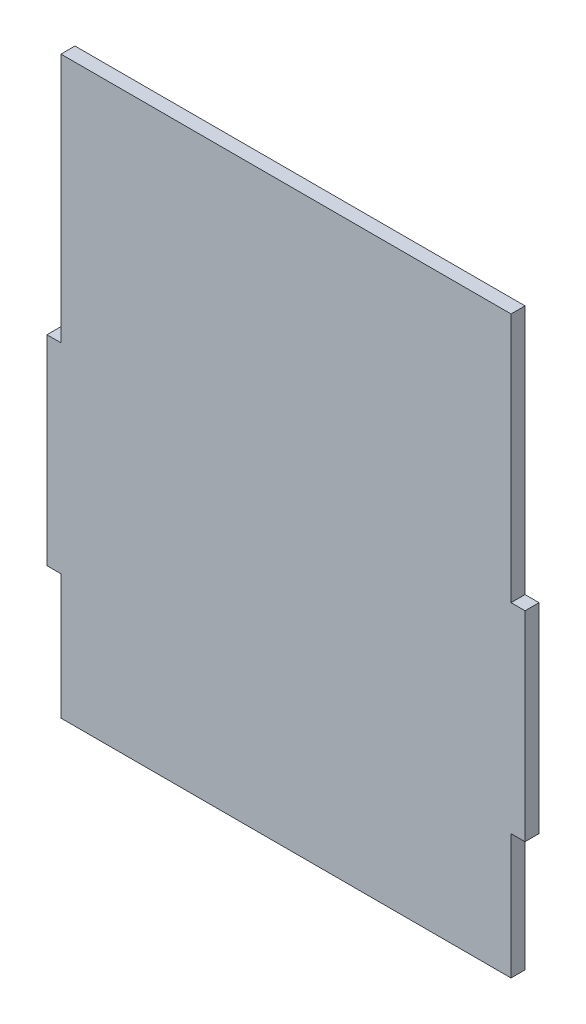
ISO-10303-21;
HEADER;
FILE_DESCRIPTION(('STEP AP214'),'2;1');
FILE_NAME('part.step','',(''),(''),'','','');
FILE_SCHEMA(('AUTOMOTIVE_DESIGN { 1 0 10303 214 1 1 1 1 }'));
ENDSEC;
DATA;
#1=APPLICATION_CONTEXT('core data for automotive mechanical design processes');
#2=APPLICATION_PROTOCOL_DEFINITION('international standard','automotive_design',2000,#1);
#3=PRODUCT_CONTEXT('',#1,'mechanical');
#4=PRODUCT('Part','Part','',(#3));
#5=PRODUCT_RELATED_PRODUCT_CATEGORY('part','',(#4));
#6=PRODUCT_DEFINITION_FORMATION('','',#4);
#7=PRODUCT_DEFINITION_CONTEXT('part definition',#1,'design');
#8=PRODUCT_DEFINITION('design','',#6,#7);
#9=PRODUCT_DEFINITION_SHAPE('','',#8);
#10=(LENGTH_UNIT() NAMED_UNIT(*) SI_UNIT(.MILLI.,.METRE.));
#11=(NAMED_UNIT(*) PLANE_ANGLE_UNIT() SI_UNIT($,.RADIAN.));
#12=(NAMED_UNIT(*) SI_UNIT($,.STERADIAN.) SOLID_ANGLE_UNIT());
#13=UNCERTAINTY_MEASURE_WITH_UNIT(LENGTH_MEASURE(1.E-05),#10,'distance_accuracy_value','');
#14=(GEOMETRIC_REPRESENTATION_CONTEXT(3) GLOBAL_UNCERTAINTY_ASSIGNED_CONTEXT((#13)) GLOBAL_UNIT_ASSIGNED_CONTEXT((#10,
#11,#12)) REPRESENTATION_CONTEXT('',''));
#15=CARTESIAN_POINT('',(0.,0.,0.));
#16=DIRECTION('',(0.,0.,1.));
#17=DIRECTION('',(1.,0.,0.));
#18=AXIS2_PLACEMENT_3D('',#15,#16,#17);
#19=CARTESIAN_POINT('',(45.,7.50000000000001,1.4));
#20=DIRECTION('',(-1.,0.,0.));
#21=DIRECTION('',(0.,-1.,0.));
#22=AXIS2_PLACEMENT_3D('',#19,#20,#21);
#23=PLANE('',#22);
#24=DIRECTION('',(0.,1.,0.));
#25=VECTOR('',#24,1.);
#26=CARTESIAN_POINT('',(45.,7.50000000000001,-1.4));
#27=LINE('',#26,#25);
#28=CARTESIAN_POINT('',(45.,7.50000000000001,-1.4));
#29=VERTEX_POINT('',#28);
#30=CARTESIAN_POINT('',(45.,57.5,-1.4));
#31=VERTEX_POINT('',#30);
#32=EDGE_CURVE('E164',#29,#31,#27,.T.);
#33=ORIENTED_EDGE('',*,*,#32,.T.);
#34=DIRECTION('',(0.,0.,-1.));
#35=VECTOR('',#34,1.);
#36=CARTESIAN_POINT('',(45.,57.5,1.4));
#37=LINE('',#36,#35);
#38=CARTESIAN_POINT('',(45.,57.5,1.4));
#39=VERTEX_POINT('',#38);
#40=EDGE_CURVE('E11',#39,#31,#37,.T.);
#41=ORIENTED_EDGE('',*,*,#40,.F.);
#42=DIRECTION('',(0.,1.,0.));
#43=VECTOR('',#42,1.);
#44=CARTESIAN_POINT('',(45.,7.50000000000001,1.4));
#45=LINE('',#44,#43);
#46=CARTESIAN_POINT('',(45.,7.50000000000001,1.4));
#47=VERTEX_POINT('',#46);
#48=EDGE_CURVE('E198',#47,#39,#45,.T.);
#49=ORIENTED_EDGE('',*,*,#48,.F.);
#50=DIRECTION('',(0.,0.,-1.));
#51=VECTOR('',#50,1.);
#52=CARTESIAN_POINT('',(45.,7.50000000000001,1.4));
#53=LINE('',#52,#51);
#54=EDGE_CURVE('E160',#47,#29,#53,.T.);
#55=ORIENTED_EDGE('',*,*,#54,.T.);
#56=EDGE_LOOP('',(#33,#41,#49,#55));
#57=FACE_BOUND('',#56,.T.);
#58=ADVANCED_FACE('F39',(#57),#23,.F.);
#59=CARTESIAN_POINT('',(-45.,57.5,1.4));
#60=DIRECTION('',(0.,-1.,0.));
#61=DIRECTION('',(1.,0.,0.));
#62=AXIS2_PLACEMENT_3D('',#59,#60,#61);
#63=PLANE('',#62);
#64=DIRECTION('',(-1.,0.,0.));
#65=VECTOR('',#64,1.);
#66=CARTESIAN_POINT('',(-45.,57.5,-1.4));
#67=LINE('',#66,#65);
#68=CARTESIAN_POINT('',(-45.,57.5,-1.4));
#69=VERTEX_POINT('',#68);
#70=EDGE_CURVE('E168',#31,#69,#67,.T.);
#71=ORIENTED_EDGE('',*,*,#70,.T.);
#72=DIRECTION('',(0.,0.,-1.));
#73=VECTOR('',#72,1.);
#74=CARTESIAN_POINT('',(-45.,57.5,1.4));
#75=LINE('',#74,#73);
#76=CARTESIAN_POINT('',(-45.,57.5,1.4));
#77=VERTEX_POINT('',#76);
#78=EDGE_CURVE('E48',#77,#69,#75,.T.);
#79=ORIENTED_EDGE('',*,*,#78,.F.);
#80=DIRECTION('',(-1.,0.,0.));
#81=VECTOR('',#80,1.);
#82=CARTESIAN_POINT('',(-45.,57.5,1.4));
#83=LINE('',#82,#81);
#84=EDGE_CURVE('E111',#39,#77,#83,.T.);
#85=ORIENTED_EDGE('',*,*,#84,.F.);
#86=ORIENTED_EDGE('',*,*,#40,.T.);
#87=EDGE_LOOP('',(#71,#79,#85,#86));
#88=FACE_BOUND('',#87,.T.);
#89=ADVANCED_FACE('F292',(#88),#63,.F.);
#90=CARTESIAN_POINT('',(-45.,7.5,1.4));
#91=DIRECTION('',(1.,0.,0.));
#92=DIRECTION('',(0.,0.,-1.));
#93=AXIS2_PLACEMENT_3D('',#90,#91,#92);
#94=PLANE('',#93);
#95=DIRECTION('',(0.,-1.,0.));
#96=VECTOR('',#95,1.);
#97=CARTESIAN_POINT('',(-45.,7.5,-1.4));
#98=LINE('',#97,#96);
#99=CARTESIAN_POINT('',(-45.,7.5,-1.4));
#100=VERTEX_POINT('',#99);
#101=EDGE_CURVE('E171',#69,#100,#98,.T.);
#102=ORIENTED_EDGE('',*,*,#101,.T.);
#103=DIRECTION('',(0.,0.,-1.));
#104=VECTOR('',#103,1.);
#105=CARTESIAN_POINT('',(-45.,7.5,1.4));
#106=LINE('',#105,#104);
#107=CARTESIAN_POINT('',(-45.,7.5,1.4));
#108=VERTEX_POINT('',#107);
#109=EDGE_CURVE('E225',#108,#100,#106,.T.);
#110=ORIENTED_EDGE('',*,*,#109,.F.);
#111=DIRECTION('',(0.,-1.,0.));
#112=VECTOR('',#111,1.);
#113=CARTESIAN_POINT('',(-45.,7.5,1.4));
#114=LINE('',#113,#112);
#115=EDGE_CURVE('E235',#77,#108,#114,.T.);
#116=ORIENTED_EDGE('',*,*,#115,.F.);
#117=ORIENTED_EDGE('',*,*,#78,.T.);
#118=EDGE_LOOP('',(#102,#110,#116,#117));
#119=FACE_BOUND('',#118,.T.);
#120=ADVANCED_FACE('F233',(#119),#94,.F.);
#121=CARTESIAN_POINT('',(-45.,7.5,1.4));
#122=DIRECTION('',(0.,-1.,0.));
#123=DIRECTION('',(1.,0.,0.));
#124=AXIS2_PLACEMENT_3D('',#121,#122,#123);
#125=PLANE('',#124);
#126=DIRECTION('',(-1.,0.,0.));
#127=VECTOR('',#126,1.);
#128=CARTESIAN_POINT('',(-45.,7.5,-1.4));
#129=LINE('',#128,#127);
#130=CARTESIAN_POINT('',(-47.8,7.5,-1.4));
#131=VERTEX_POINT('',#130);
#132=EDGE_CURVE('E174',#100,#131,#129,.T.);
#133=ORIENTED_EDGE('',*,*,#132,.T.);
#134=DIRECTION('',(0.,0.,-1.));
#135=VECTOR('',#134,1.);
#136=CARTESIAN_POINT('',(-47.8,7.5,1.4));
#137=LINE('',#136,#135);
#138=CARTESIAN_POINT('',(-47.8,7.5,1.4));
#139=VERTEX_POINT('',#138);
#140=EDGE_CURVE('E221',#139,#131,#137,.T.);
#141=ORIENTED_EDGE('',*,*,#140,.F.);
#142=DIRECTION('',(-1.,0.,0.));
#143=VECTOR('',#142,1.);
#144=CARTESIAN_POINT('',(-45.,7.5,1.4));
#145=LINE('',#144,#143);
#146=EDGE_CURVE('E254',#108,#139,#145,.T.);
#147=ORIENTED_EDGE('',*,*,#146,.F.);
#148=ORIENTED_EDGE('',*,*,#109,.T.);
#149=EDGE_LOOP('',(#133,#141,#147,#148));
#150=FACE_BOUND('',#149,.T.);
#151=ADVANCED_FACE('F244',(#150),#125,.F.);
#152=CARTESIAN_POINT('',(-47.8,-32.5,1.4));
#153=DIRECTION('',(1.,0.,0.));
#154=DIRECTION('',(0.,0.,-1.));
#155=AXIS2_PLACEMENT_3D('',#152,#153,#154);
#156=PLANE('',#155);
#157=DIRECTION('',(0.,-1.,0.));
#158=VECTOR('',#157,1.);
#159=CARTESIAN_POINT('',(-47.8,-32.5,-1.4));
#160=LINE('',#159,#158);
#161=CARTESIAN_POINT('',(-47.8,-32.5,-1.4));
#162=VERTEX_POINT('',#161);
#163=EDGE_CURVE('E177',#131,#162,#160,.T.);
#164=ORIENTED_EDGE('',*,*,#163,.T.);
#165=DIRECTION('',(0.,0.,-1.));
#166=VECTOR('',#165,1.);
#167=CARTESIAN_POINT('',(-47.8,-32.5,1.4));
#168=LINE('',#167,#166);
#169=CARTESIAN_POINT('',(-47.8,-32.5,1.4));
#170=VERTEX_POINT('',#169);
#171=EDGE_CURVE('E217',#170,#162,#168,.T.);
#172=ORIENTED_EDGE('',*,*,#171,.F.);
#173=DIRECTION('',(0.,-1.,0.));
#174=VECTOR('',#173,1.);
#175=CARTESIAN_POINT('',(-47.8,-32.5,1.4));
#176=LINE('',#175,#174);
#177=EDGE_CURVE('E250',#139,#170,#176,.T.);
#178=ORIENTED_EDGE('',*,*,#177,.F.);
#179=ORIENTED_EDGE('',*,*,#140,.T.);
#180=EDGE_LOOP('',(#164,#172,#178,#179));
#181=FACE_BOUND('',#180,.T.);
#182=ADVANCED_FACE('F248',(#181),#156,.F.);
#183=CARTESIAN_POINT('',(-45.,-32.5,1.4));
#184=DIRECTION('',(0.,1.,0.));
#185=DIRECTION('',(0.,0.,1.));
#186=AXIS2_PLACEMENT_3D('',#183,#184,#185);
#187=PLANE('',#186);
#188=DIRECTION('',(1.,0.,0.));
#189=VECTOR('',#188,1.);
#190=CARTESIAN_POINT('',(-45.,-32.5,-1.4));
#191=LINE('',#190,#189);
#192=CARTESIAN_POINT('',(-45.,-32.5,-1.4));
#193=VERTEX_POINT('',#192);
#194=EDGE_CURVE('E180',#162,#193,#191,.T.);
#195=ORIENTED_EDGE('',*,*,#194,.T.);
#196=DIRECTION('',(0.,0.,-1.));
#197=VECTOR('',#196,1.);
#198=CARTESIAN_POINT('',(-45.,-32.5,1.4));
#199=LINE('',#198,#197);
#200=CARTESIAN_POINT('',(-45.,-32.5,1.4));
#201=VERTEX_POINT('',#200);
#202=EDGE_CURVE('E213',#201,#193,#199,.T.);
#203=ORIENTED_EDGE('',*,*,#202,.F.);
#204=DIRECTION('',(1.,0.,0.));
#205=VECTOR('',#204,1.);
#206=CARTESIAN_POINT('',(-45.,-32.5,1.4));
#207=LINE('',#206,#205);
#208=EDGE_CURVE('E253',#170,#201,#207,.T.);
#209=ORIENTED_EDGE('',*,*,#208,.F.);
#210=ORIENTED_EDGE('',*,*,#171,.T.);
#211=EDGE_LOOP('',(#195,#203,#209,#210));
#212=FACE_BOUND('',#211,.T.);
#213=ADVANCED_FACE('F305',(#212),#187,.F.);
#214=CARTESIAN_POINT('',(-45.,-57.5,1.4));
#215=DIRECTION('',(1.,0.,0.));
#216=DIRECTION('',(0.,1.,0.));
#217=AXIS2_PLACEMENT_3D('',#214,#215,#216);
#218=PLANE('',#217);
#219=DIRECTION('',(0.,-1.,0.));
#220=VECTOR('',#219,1.);
#221=CARTESIAN_POINT('',(-45.,-57.5,-1.4));
#222=LINE('',#221,#220);
#223=CARTESIAN_POINT('',(-45.,-57.5,-1.4));
#224=VERTEX_POINT('',#223);
#225=EDGE_CURVE('E183',#193,#224,#222,.T.);
#226=ORIENTED_EDGE('',*,*,#225,.T.);
#227=DIRECTION('',(0.,0.,-1.));
#228=VECTOR('',#227,1.);
#229=CARTESIAN_POINT('',(-45.,-57.5,1.4));
#230=LINE('',#229,#228);
#231=CARTESIAN_POINT('',(-45.,-57.5,1.4));
#232=VERTEX_POINT('',#231);
#233=EDGE_CURVE('E209',#232,#224,#230,.T.);
#234=ORIENTED_EDGE('',*,*,#233,.F.);
#235=DIRECTION('',(0.,-1.,0.));
#236=VECTOR('',#235,1.);
#237=CARTESIAN_POINT('',(-45.,-57.5,1.4));
#238=LINE('',#237,#236);
#239=EDGE_CURVE('E258',#201,#232,#238,.T.);
#240=ORIENTED_EDGE('',*,*,#239,.F.);
#241=ORIENTED_EDGE('',*,*,#202,.T.);
#242=EDGE_LOOP('',(#226,#234,#240,#241));
#243=FACE_BOUND('',#242,.T.);
#244=ADVANCED_FACE('F308',(#243),#218,.F.);
#245=CARTESIAN_POINT('',(-45.,-57.5,1.4));
#246=DIRECTION('',(0.,1.,0.));
#247=DIRECTION('',(-1.,0.,0.));
#248=AXIS2_PLACEMENT_3D('',#245,#246,#247);
#249=PLANE('',#248);
#250=DIRECTION('',(1.,0.,0.));
#251=VECTOR('',#250,1.);
#252=CARTESIAN_POINT('',(-45.,-57.5,-1.4));
#253=LINE('',#252,#251);
#254=CARTESIAN_POINT('',(45.,-57.5,-1.4));
#255=VERTEX_POINT('',#254);
#256=EDGE_CURVE('E186',#224,#255,#253,.T.);
#257=ORIENTED_EDGE('',*,*,#256,.T.);
#258=DIRECTION('',(0.,0.,-1.));
#259=VECTOR('',#258,1.);
#260=CARTESIAN_POINT('',(45.,-57.5,1.4));
#261=LINE('',#260,#259);
#262=CARTESIAN_POINT('',(45.,-57.5,1.4));
#263=VERTEX_POINT('',#262);
#264=EDGE_CURVE('E205',#263,#255,#261,.T.);
#265=ORIENTED_EDGE('',*,*,#264,.F.);
#266=DIRECTION('',(1.,0.,0.));
#267=VECTOR('',#266,1.);
#268=CARTESIAN_POINT('',(-45.,-57.5,1.4));
#269=LINE('',#268,#267);
#270=EDGE_CURVE('E265',#232,#263,#269,.T.);
#271=ORIENTED_EDGE('',*,*,#270,.F.);
#272=ORIENTED_EDGE('',*,*,#233,.T.);
#273=EDGE_LOOP('',(#257,#265,#271,#272));
#274=FACE_BOUND('',#273,.T.);
#275=ADVANCED_FACE('F273',(#274),#249,.F.);
#276=CARTESIAN_POINT('',(45.,-57.5,1.4));
#277=DIRECTION('',(-1.,0.,0.));
#278=DIRECTION('',(0.,-1.,0.));
#279=AXIS2_PLACEMENT_3D('',#276,#277,#278);
#280=PLANE('',#279);
#281=DIRECTION('',(0.,1.,0.));
#282=VECTOR('',#281,1.);
#283=CARTESIAN_POINT('',(45.,-57.5,-1.4));
#284=LINE('',#283,#282);
#285=CARTESIAN_POINT('',(45.,-32.5,-1.4));
#286=VERTEX_POINT('',#285);
#287=EDGE_CURVE('E189',#255,#286,#284,.T.);
#288=ORIENTED_EDGE('',*,*,#287,.T.);
#289=DIRECTION('',(0.,0.,-1.));
#290=VECTOR('',#289,1.);
#291=CARTESIAN_POINT('',(45.,-32.5,1.4));
#292=LINE('',#291,#290);
#293=CARTESIAN_POINT('',(45.,-32.5,1.4));
#294=VERTEX_POINT('',#293);
#295=EDGE_CURVE('E153',#294,#286,#292,.T.);
#296=ORIENTED_EDGE('',*,*,#295,.F.);
#297=DIRECTION('',(0.,1.,0.));
#298=VECTOR('',#297,1.);
#299=CARTESIAN_POINT('',(45.,-57.5,1.4));
#300=LINE('',#299,#298);
#301=EDGE_CURVE('E142',#263,#294,#300,.T.);
#302=ORIENTED_EDGE('',*,*,#301,.F.);
#303=ORIENTED_EDGE('',*,*,#264,.T.);
#304=EDGE_LOOP('',(#288,#296,#302,#303));
#305=FACE_BOUND('',#304,.T.);
#306=ADVANCED_FACE('F277',(#305),#280,.F.);
#307=CARTESIAN_POINT('',(45.,-32.5,1.4));
#308=DIRECTION('',(0.,1.,0.));
#309=DIRECTION('',(0.,0.,1.));
#310=AXIS2_PLACEMENT_3D('',#307,#308,#309);
#311=PLANE('',#310);
#312=DIRECTION('',(1.,0.,0.));
#313=VECTOR('',#312,1.);
#314=CARTESIAN_POINT('',(45.,-32.5,-1.4));
#315=LINE('',#314,#313);
#316=CARTESIAN_POINT('',(47.8,-32.5,-1.4));
#317=VERTEX_POINT('',#316);
#318=EDGE_CURVE('E151',#286,#317,#315,.T.);
#319=ORIENTED_EDGE('',*,*,#318,.T.);
#320=DIRECTION('',(0.,0.,-1.));
#321=VECTOR('',#320,1.);
#322=CARTESIAN_POINT('',(47.8,-32.5,1.4));
#323=LINE('',#322,#321);
#324=CARTESIAN_POINT('',(47.8,-32.5,1.4));
#325=VERTEX_POINT('',#324);
#326=EDGE_CURVE('E148',#325,#317,#323,.T.);
#327=ORIENTED_EDGE('',*,*,#326,.F.);
#328=DIRECTION('',(1.,0.,0.));
#329=VECTOR('',#328,1.);
#330=CARTESIAN_POINT('',(45.,-32.5,1.4));
#331=LINE('',#330,#329);
#332=EDGE_CURVE('E136',#294,#325,#331,.T.);
#333=ORIENTED_EDGE('',*,*,#332,.F.);
#334=ORIENTED_EDGE('',*,*,#295,.T.);
#335=EDGE_LOOP('',(#319,#327,#333,#334));
#336=FACE_BOUND('',#335,.T.);
#337=ADVANCED_FACE('F149',(#336),#311,.F.);
#338=CARTESIAN_POINT('',(47.8,-32.5,1.4));
#339=DIRECTION('',(-1.,0.,0.));
#340=DIRECTION('',(0.,0.,1.));
#341=AXIS2_PLACEMENT_3D('',#338,#339,#340);
#342=PLANE('',#341);
#343=DIRECTION('',(0.,1.,0.));
#344=VECTOR('',#343,1.);
#345=CARTESIAN_POINT('',(47.8,-32.5,-1.4));
#346=LINE('',#345,#344);
#347=CARTESIAN_POINT('',(47.8,7.50000000000001,-1.4));
#348=VERTEX_POINT('',#347);
#349=EDGE_CURVE('E97',#317,#348,#346,.T.);
#350=ORIENTED_EDGE('',*,*,#349,.T.);
#351=DIRECTION('',(0.,0.,-1.));
#352=VECTOR('',#351,1.);
#353=CARTESIAN_POINT('',(47.8,7.50000000000001,1.4));
#354=LINE('',#353,#352);
#355=CARTESIAN_POINT('',(47.8,7.50000000000001,1.4));
#356=VERTEX_POINT('',#355);
#357=EDGE_CURVE('E154',#356,#348,#354,.T.);
#358=ORIENTED_EDGE('',*,*,#357,.F.);
#359=DIRECTION('',(0.,1.,0.));
#360=VECTOR('',#359,1.);
#361=CARTESIAN_POINT('',(47.8,-32.5,1.4));
#362=LINE('',#361,#360);
#363=EDGE_CURVE('E140',#325,#356,#362,.T.);
#364=ORIENTED_EDGE('',*,*,#363,.F.);
#365=ORIENTED_EDGE('',*,*,#326,.T.);
#366=EDGE_LOOP('',(#350,#358,#364,#365));
#367=FACE_BOUND('',#366,.T.);
#368=ADVANCED_FACE('F156',(#367),#342,.F.);
#369=CARTESIAN_POINT('',(45.,7.50000000000001,1.4));
#370=DIRECTION('',(0.,-1.,0.));
#371=DIRECTION('',(1.,0.,0.));
#372=AXIS2_PLACEMENT_3D('',#369,#370,#371);
#373=PLANE('',#372);
#374=DIRECTION('',(-1.,0.,0.));
#375=VECTOR('',#374,1.);
#376=CARTESIAN_POINT('',(45.,7.50000000000001,-1.4));
#377=LINE('',#376,#375);
#378=EDGE_CURVE('E103',#348,#29,#377,.T.);
#379=ORIENTED_EDGE('',*,*,#378,.T.);
#380=ORIENTED_EDGE('',*,*,#54,.F.);
#381=DIRECTION('',(-1.,0.,0.));
#382=VECTOR('',#381,1.);
#383=CARTESIAN_POINT('',(45.,7.50000000000001,1.4));
#384=LINE('',#383,#382);
#385=EDGE_CURVE('E56',#356,#47,#384,.T.);
#386=ORIENTED_EDGE('',*,*,#385,.F.);
#387=ORIENTED_EDGE('',*,*,#357,.T.);
#388=EDGE_LOOP('',(#379,#380,#386,#387));
#389=FACE_BOUND('',#388,.T.);
#390=ADVANCED_FACE('F281',(#389),#373,.F.);
#391=CARTESIAN_POINT('',(0.,0.,1.4));
#392=DIRECTION('',(0.,0.,-1.));
#393=DIRECTION('',(-1.,0.,0.));
#394=AXIS2_PLACEMENT_3D('',#391,#392,#393);
#395=PLANE('',#394);
#396=ORIENTED_EDGE('',*,*,#48,.T.);
#397=ORIENTED_EDGE('',*,*,#84,.T.);
#398=ORIENTED_EDGE('',*,*,#115,.T.);
#399=ORIENTED_EDGE('',*,*,#146,.T.);
#400=ORIENTED_EDGE('',*,*,#177,.T.);
#401=ORIENTED_EDGE('',*,*,#208,.T.);
#402=ORIENTED_EDGE('',*,*,#239,.T.);
#403=ORIENTED_EDGE('',*,*,#270,.T.);
#404=ORIENTED_EDGE('',*,*,#301,.T.);
#405=ORIENTED_EDGE('',*,*,#332,.T.);
#406=ORIENTED_EDGE('',*,*,#363,.T.);
#407=ORIENTED_EDGE('',*,*,#385,.T.);
#408=EDGE_LOOP('',(#396,#397,#398,#399,#400,#401,#402,#403,#404,#405,#406,#407));
#409=FACE_BOUND('',#408,.T.);
#410=ADVANCED_FACE('F138',(#409),#395,.F.);
#411=CARTESIAN_POINT('',(0.,0.,-1.4));
#412=DIRECTION('',(0.,0.,-1.));
#413=DIRECTION('',(-1.,0.,0.));
#414=AXIS2_PLACEMENT_3D('',#411,#412,#413);
#415=PLANE('',#414);
#416=ORIENTED_EDGE('',*,*,#32,.F.);
#417=ORIENTED_EDGE('',*,*,#378,.F.);
#418=ORIENTED_EDGE('',*,*,#349,.F.);
#419=ORIENTED_EDGE('',*,*,#318,.F.);
#420=ORIENTED_EDGE('',*,*,#287,.F.);
#421=ORIENTED_EDGE('',*,*,#256,.F.);
#422=ORIENTED_EDGE('',*,*,#225,.F.);
#423=ORIENTED_EDGE('',*,*,#194,.F.);
#424=ORIENTED_EDGE('',*,*,#163,.F.);
#425=ORIENTED_EDGE('',*,*,#132,.F.);
#426=ORIENTED_EDGE('',*,*,#101,.F.);
#427=ORIENTED_EDGE('',*,*,#70,.F.);
#428=EDGE_LOOP('',(#416,#417,#418,#419,#420,#421,#422,#423,#424,#425,#426,#427));
#429=FACE_BOUND('',#428,.T.);
#430=ADVANCED_FACE('F239',(#429),#415,.T.);
#431=CLOSED_SHELL('',(#58,#89,#120,#151,#182,#213,#244,#275,#306,#337,#368,#390,#410,#430));
#432=MANIFOLD_SOLID_BREP('B2',#431);
#433=ADVANCED_BREP_SHAPE_REPRESENTATION('',(#18,#432),#14);
#434=SHAPE_DEFINITION_REPRESENTATION(#9,#433);
ENDSEC;
END-ISO-10303-21;
